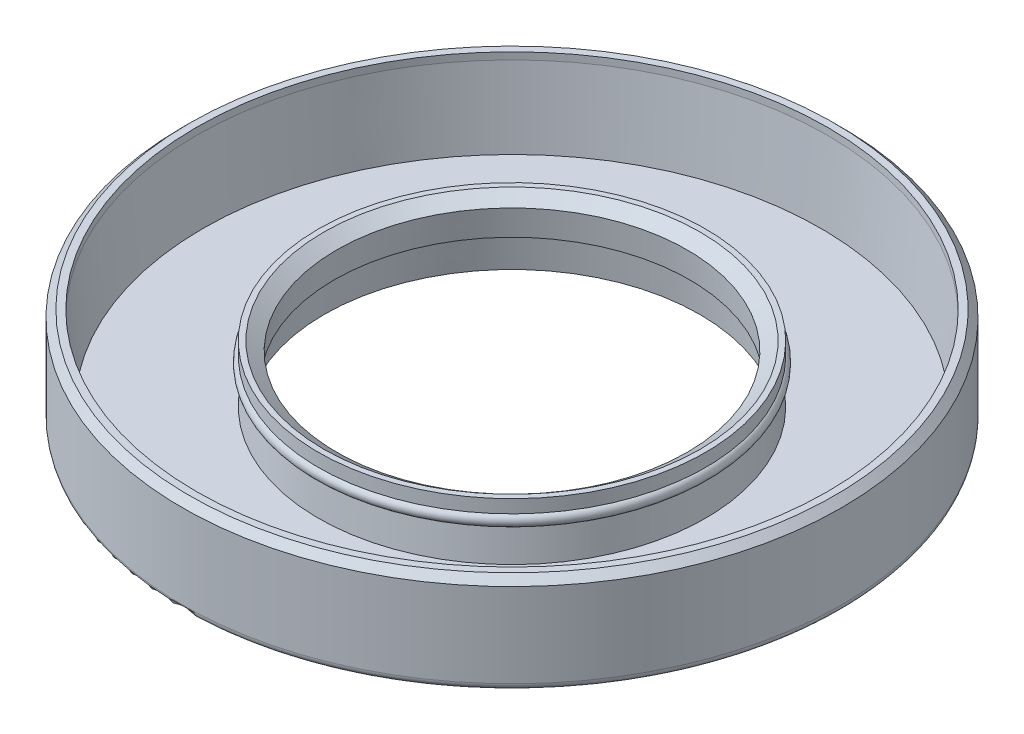
ISO-10303-21;
HEADER;
FILE_DESCRIPTION(('STEP AP214'),'2;1');
FILE_NAME('part.step','',(''),(''),'','','');
FILE_SCHEMA(('AUTOMOTIVE_DESIGN { 1 0 10303 214 1 1 1 1 }'));
ENDSEC;
DATA;
#1=APPLICATION_CONTEXT('core data for automotive mechanical design processes');
#2=APPLICATION_PROTOCOL_DEFINITION('international standard','automotive_design',2000,#1);
#3=PRODUCT_CONTEXT('',#1,'mechanical');
#4=PRODUCT('Part','Part','',(#3));
#5=PRODUCT_RELATED_PRODUCT_CATEGORY('part','',(#4));
#6=PRODUCT_DEFINITION_FORMATION('','',#4);
#7=PRODUCT_DEFINITION_CONTEXT('part definition',#1,'design');
#8=PRODUCT_DEFINITION('design','',#6,#7);
#9=PRODUCT_DEFINITION_SHAPE('','',#8);
#10=(LENGTH_UNIT() NAMED_UNIT(*) SI_UNIT(.MILLI.,.METRE.));
#11=(NAMED_UNIT(*) PLANE_ANGLE_UNIT() SI_UNIT($,.RADIAN.));
#12=(NAMED_UNIT(*) SI_UNIT($,.STERADIAN.) SOLID_ANGLE_UNIT());
#13=UNCERTAINTY_MEASURE_WITH_UNIT(LENGTH_MEASURE(1.E-05),#10,'distance_accuracy_value','');
#14=(GEOMETRIC_REPRESENTATION_CONTEXT(3) GLOBAL_UNCERTAINTY_ASSIGNED_CONTEXT((#13)) GLOBAL_UNIT_ASSIGNED_CONTEXT((#10,
#11,#12)) REPRESENTATION_CONTEXT('',''));
#15=CARTESIAN_POINT('',(0.,0.,0.));
#16=DIRECTION('',(0.,0.,1.));
#17=DIRECTION('',(1.,0.,0.));
#18=AXIS2_PLACEMENT_3D('',#15,#16,#17);
#19=CARTESIAN_POINT('',(0.,1.,0.));
#20=DIRECTION('',(0.,1.,0.));
#21=DIRECTION('',(-1.,0.,0.));
#22=AXIS2_PLACEMENT_3D('',#19,#20,#21);
#23=CONICAL_SURFACE('',#22,22.0188123506074,0.0872664625997133);
#24=CARTESIAN_POINT('',(0.,6.5,0.));
#25=DIRECTION('',(0.,1.,0.));
#26=DIRECTION('',(-1.,0.,0.));
#27=AXIS2_PLACEMENT_3D('',#24,#25,#26);
#28=CIRCLE('',#27,22.5);
#29=CARTESIAN_POINT('',(-22.5,6.5,0.));
#30=VERTEX_POINT('',#29);
#31=EDGE_CURVE('E10',#30,#30,#28,.T.);
#32=ORIENTED_EDGE('',*,*,#31,.T.);
#33=EDGE_LOOP('',(#32));
#34=FACE_BOUND('',#33,.T.);
#35=CARTESIAN_POINT('',(0.,1.,0.));
#36=DIRECTION('',(0.,1.,0.));
#37=DIRECTION('',(-1.,0.,0.));
#38=AXIS2_PLACEMENT_3D('',#35,#36,#37);
#39=CIRCLE('',#38,22.0188123506074);
#40=CARTESIAN_POINT('',(-22.0188123506074,0.999999999999998,0.));
#41=VERTEX_POINT('',#40);
#42=EDGE_CURVE('E67',#41,#41,#39,.T.);
#43=ORIENTED_EDGE('',*,*,#42,.F.);
#44=EDGE_LOOP('',(#43));
#45=FACE_BOUND('',#44,.T.);
#46=ADVANCED_FACE('F15',(#34,#45),#23,.F.);
#47=CARTESIAN_POINT('',(0.,5.83619336924023,0.));
#48=DIRECTION('',(0.,1.,0.));
#49=DIRECTION('',(-1.,0.,0.));
#50=AXIS2_PLACEMENT_3D('',#47,#48,#49);
#51=CYLINDRICAL_SURFACE('',#50,22.5);
#52=CARTESIAN_POINT('',(0.,7.,0.));
#53=DIRECTION('',(0.,1.,0.));
#54=DIRECTION('',(-1.,0.,0.));
#55=AXIS2_PLACEMENT_3D('',#52,#53,#54);
#56=CIRCLE('',#55,22.5);
#57=CARTESIAN_POINT('',(-22.5,7.,0.));
#58=VERTEX_POINT('',#57);
#59=EDGE_CURVE('E21',#58,#58,#56,.T.);
#60=ORIENTED_EDGE('',*,*,#59,.T.);
#61=EDGE_LOOP('',(#60));
#62=FACE_BOUND('',#61,.T.);
#63=ORIENTED_EDGE('',*,*,#31,.F.);
#64=EDGE_LOOP('',(#63));
#65=FACE_BOUND('',#64,.T.);
#66=ADVANCED_FACE('F75',(#62,#65),#51,.F.);
#67=CARTESIAN_POINT('',(-22.5,7.,0.));
#68=DIRECTION('',(0.,1.,0.));
#69=DIRECTION('',(-1.,0.,0.));
#70=AXIS2_PLACEMENT_3D('',#67,#68,#69);
#71=PLANE('',#70);
#72=CARTESIAN_POINT('',(0.,7.,0.));
#73=DIRECTION('',(0.,1.,0.));
#74=DIRECTION('',(-1.,0.,0.));
#75=AXIS2_PLACEMENT_3D('',#72,#73,#74);
#76=CIRCLE('',#75,23.);
#77=CARTESIAN_POINT('',(-23.,7.,0.));
#78=VERTEX_POINT('',#77);
#79=EDGE_CURVE('E25',#78,#78,#76,.T.);
#80=ORIENTED_EDGE('',*,*,#79,.T.);
#81=EDGE_LOOP('',(#80));
#82=FACE_BOUND('',#81,.T.);
#83=ORIENTED_EDGE('',*,*,#59,.F.);
#84=EDGE_LOOP('',(#83));
#85=FACE_BOUND('',#84,.T.);
#86=ADVANCED_FACE('F81',(#82,#85),#71,.T.);
#87=CARTESIAN_POINT('',(0.,7.,0.));
#88=DIRECTION('',(0.,-1.,0.));
#89=DIRECTION('',(1.,0.,0.));
#90=AXIS2_PLACEMENT_3D('',#87,#88,#89);
#91=CONICAL_SURFACE('',#90,23.,0.785398163397449);
#92=CARTESIAN_POINT('',(0.,6.5,0.));
#93=DIRECTION('',(0.,1.,0.));
#94=DIRECTION('',(-1.,0.,0.));
#95=AXIS2_PLACEMENT_3D('',#92,#93,#94);
#96=CIRCLE('',#95,23.5);
#97=CARTESIAN_POINT('',(-23.5,6.5,0.));
#98=VERTEX_POINT('',#97);
#99=EDGE_CURVE('E29',#98,#98,#96,.T.);
#100=ORIENTED_EDGE('',*,*,#99,.T.);
#101=EDGE_LOOP('',(#100));
#102=FACE_BOUND('',#101,.T.);
#103=ORIENTED_EDGE('',*,*,#79,.F.);
#104=EDGE_LOOP('',(#103));
#105=FACE_BOUND('',#104,.T.);
#106=ADVANCED_FACE('F86',(#102,#105),#91,.T.);
#107=CARTESIAN_POINT('',(0.,5.83619336924023,0.));
#108=DIRECTION('',(0.,1.,0.));
#109=DIRECTION('',(-1.,0.,0.));
#110=AXIS2_PLACEMENT_3D('',#107,#108,#109);
#111=CYLINDRICAL_SURFACE('',#110,23.5);
#112=CARTESIAN_POINT('',(0.,0.5,0.));
#113=DIRECTION('',(0.,1.,0.));
#114=DIRECTION('',(-1.,0.,0.));
#115=AXIS2_PLACEMENT_3D('',#112,#113,#114);
#116=CIRCLE('',#115,23.5);
#117=CARTESIAN_POINT('',(-23.5,0.499999999999997,0.));
#118=VERTEX_POINT('',#117);
#119=EDGE_CURVE('E34',#118,#118,#116,.T.);
#120=ORIENTED_EDGE('',*,*,#119,.T.);
#121=EDGE_LOOP('',(#120));
#122=FACE_BOUND('',#121,.T.);
#123=ORIENTED_EDGE('',*,*,#99,.F.);
#124=EDGE_LOOP('',(#123));
#125=FACE_BOUND('',#124,.T.);
#126=ADVANCED_FACE('F93',(#122,#125),#111,.T.);
#127=CARTESIAN_POINT('',(0.,0.5,0.));
#128=DIRECTION('',(0.,1.,0.));
#129=DIRECTION('',(-1.,0.,0.));
#130=AXIS2_PLACEMENT_3D('',#127,#128,#129);
#131=TOROIDAL_SURFACE('',#130,23.,0.5);
#132=CARTESIAN_POINT('',(0.,0.,0.));
#133=DIRECTION('',(0.,1.,0.));
#134=DIRECTION('',(-1.,0.,0.));
#135=AXIS2_PLACEMENT_3D('',#132,#133,#134);
#136=CIRCLE('',#135,23.);
#137=CARTESIAN_POINT('',(-23.,0.,0.));
#138=VERTEX_POINT('',#137);
#139=EDGE_CURVE('E37',#138,#138,#136,.T.);
#140=ORIENTED_EDGE('',*,*,#139,.T.);
#141=EDGE_LOOP('',(#140));
#142=FACE_BOUND('',#141,.T.);
#143=ORIENTED_EDGE('',*,*,#119,.F.);
#144=EDGE_LOOP('',(#143));
#145=FACE_BOUND('',#144,.T.);
#146=ADVANCED_FACE('F97',(#142,#145),#131,.T.);
#147=CARTESIAN_POINT('',(-23.,0.,0.));
#148=DIRECTION('',(0.,-1.,0.));
#149=DIRECTION('',(1.,0.,0.));
#150=AXIS2_PLACEMENT_3D('',#147,#148,#149);
#151=PLANE('',#150);
#152=CARTESIAN_POINT('',(0.,0.,0.));
#153=DIRECTION('',(0.,1.,0.));
#154=DIRECTION('',(-1.,0.,0.));
#155=AXIS2_PLACEMENT_3D('',#152,#153,#154);
#156=CIRCLE('',#155,13.3874497956148);
#157=CARTESIAN_POINT('',(-13.3874497956148,0.,0.));
#158=VERTEX_POINT('',#157);
#159=EDGE_CURVE('E40',#158,#158,#156,.T.);
#160=ORIENTED_EDGE('',*,*,#159,.T.);
#161=EDGE_LOOP('',(#160));
#162=FACE_BOUND('',#161,.T.);
#163=ORIENTED_EDGE('',*,*,#139,.F.);
#164=EDGE_LOOP('',(#163));
#165=FACE_BOUND('',#164,.T.);
#166=ADVANCED_FACE('F101',(#162,#165),#151,.T.);
#167=CARTESIAN_POINT('',(0.,0.,0.));
#168=DIRECTION('',(0.,-1.,0.));
#169=DIRECTION('',(1.,0.,0.));
#170=AXIS2_PLACEMENT_3D('',#167,#168,#169);
#171=CONICAL_SURFACE('',#170,13.3874497956148,0.087266462599719);
#172=CARTESIAN_POINT('',(0.,2.5,0.));
#173=DIRECTION('',(0.,1.,0.));
#174=DIRECTION('',(-1.,0.,0.));
#175=AXIS2_PLACEMENT_3D('',#172,#173,#174);
#176=CIRCLE('',#175,13.1687281368);
#177=CARTESIAN_POINT('',(-13.1687281368,2.5,0.));
#178=VERTEX_POINT('',#177);
#179=EDGE_CURVE('E43',#178,#178,#176,.T.);
#180=ORIENTED_EDGE('',*,*,#179,.T.);
#181=EDGE_LOOP('',(#180));
#182=FACE_BOUND('',#181,.T.);
#183=ORIENTED_EDGE('',*,*,#159,.F.);
#184=EDGE_LOOP('',(#183));
#185=FACE_BOUND('',#184,.T.);
#186=ADVANCED_FACE('F105',(#182,#185),#171,.F.);
#187=CARTESIAN_POINT('',(-12.6687281368,2.5,0.));
#188=DIRECTION('',(0.,-1.,0.));
#189=DIRECTION('',(1.,0.,0.));
#190=AXIS2_PLACEMENT_3D('',#187,#188,#189);
#191=PLANE('',#190);
#192=CARTESIAN_POINT('',(0.,2.5,0.));
#193=DIRECTION('',(0.,1.,0.));
#194=DIRECTION('',(-1.,0.,0.));
#195=AXIS2_PLACEMENT_3D('',#192,#193,#194);
#196=CIRCLE('',#195,12.6687281368);
#197=CARTESIAN_POINT('',(-12.6687281368,2.5,0.));
#198=VERTEX_POINT('',#197);
#199=EDGE_CURVE('E46',#198,#198,#196,.T.);
#200=ORIENTED_EDGE('',*,*,#199,.T.);
#201=EDGE_LOOP('',(#200));
#202=FACE_BOUND('',#201,.T.);
#203=ORIENTED_EDGE('',*,*,#179,.F.);
#204=EDGE_LOOP('',(#203));
#205=FACE_BOUND('',#204,.T.);
#206=ADVANCED_FACE('F109',(#202,#205),#191,.T.);
#207=CARTESIAN_POINT('',(0.,2.5,0.));
#208=DIRECTION('',(0.,-1.,0.));
#209=DIRECTION('',(1.,0.,0.));
#210=AXIS2_PLACEMENT_3D('',#207,#208,#209);
#211=CONICAL_SURFACE('',#210,12.6687281368,0.087266462599721);
#212=CARTESIAN_POINT('',(0.,4.42857142857144,0.));
#213=DIRECTION('',(0.,1.,0.));
#214=DIRECTION('',(-1.,0.,0.));
#215=AXIS2_PLACEMENT_3D('',#212,#213,#214);
#216=CIRCLE('',#215,12.5);
#217=CARTESIAN_POINT('',(-12.5,4.42857142857144,0.));
#218=VERTEX_POINT('',#217);
#219=EDGE_CURVE('E49',#218,#218,#216,.T.);
#220=ORIENTED_EDGE('',*,*,#219,.T.);
#221=EDGE_LOOP('',(#220));
#222=FACE_BOUND('',#221,.T.);
#223=ORIENTED_EDGE('',*,*,#199,.F.);
#224=EDGE_LOOP('',(#223));
#225=FACE_BOUND('',#224,.T.);
#226=ADVANCED_FACE('F113',(#222,#225),#211,.F.);
#227=CARTESIAN_POINT('',(0.,4.42857142857144,0.));
#228=DIRECTION('',(0.,1.,0.));
#229=DIRECTION('',(-1.,0.,0.));
#230=AXIS2_PLACEMENT_3D('',#227,#228,#229);
#231=CONICAL_SURFACE('',#230,12.5,0.95993108859688);
#232=CARTESIAN_POINT('',(0.,5.07142857142858,0.));
#233=DIRECTION('',(0.,1.,0.));
#234=DIRECTION('',(-1.,0.,0.));
#235=AXIS2_PLACEMENT_3D('',#232,#233,#234);
#236=CIRCLE('',#235,13.4180951471914);
#237=CARTESIAN_POINT('',(-13.4180951471914,5.07142857142858,0.));
#238=VERTEX_POINT('',#237);
#239=EDGE_CURVE('E52',#238,#238,#236,.T.);
#240=ORIENTED_EDGE('',*,*,#239,.T.);
#241=EDGE_LOOP('',(#240));
#242=FACE_BOUND('',#241,.T.);
#243=ORIENTED_EDGE('',*,*,#219,.F.);
#244=EDGE_LOOP('',(#243));
#245=FACE_BOUND('',#244,.T.);
#246=ADVANCED_FACE('F117',(#242,#245),#231,.F.);
#247=CARTESIAN_POINT('',(-13.4180951471914,5.07142857142858,0.));
#248=DIRECTION('',(0.,1.,0.));
#249=DIRECTION('',(-1.,0.,0.));
#250=AXIS2_PLACEMENT_3D('',#247,#248,#249);
#251=PLANE('',#250);
#252=CARTESIAN_POINT('',(0.,5.07142857142858,0.));
#253=DIRECTION('',(0.,1.,0.));
#254=DIRECTION('',(-1.,0.,0.));
#255=AXIS2_PLACEMENT_3D('',#252,#253,#254);
#256=CIRCLE('',#255,13.8018710508606);
#257=CARTESIAN_POINT('',(-13.8018710508606,5.07142857142858,0.));
#258=VERTEX_POINT('',#257);
#259=EDGE_CURVE('E55',#258,#258,#256,.T.);
#260=ORIENTED_EDGE('',*,*,#259,.T.);
#261=EDGE_LOOP('',(#260));
#262=FACE_BOUND('',#261,.T.);
#263=ORIENTED_EDGE('',*,*,#239,.F.);
#264=EDGE_LOOP('',(#263));
#265=FACE_BOUND('',#264,.T.);
#266=ADVANCED_FACE('F121',(#262,#265),#251,.T.);
#267=CARTESIAN_POINT('',(0.,5.83619336924023,0.));
#268=DIRECTION('',(0.,1.,0.));
#269=DIRECTION('',(-1.,0.,0.));
#270=AXIS2_PLACEMENT_3D('',#267,#268,#269);
#271=CYLINDRICAL_SURFACE('',#270,13.8018710508606);
#272=CARTESIAN_POINT('',(0.,4.13322405605208,0.));
#273=DIRECTION('',(0.,1.,0.));
#274=DIRECTION('',(-1.,0.,0.));
#275=AXIS2_PLACEMENT_3D('',#272,#273,#274);
#276=CIRCLE('',#275,13.8018710508606);
#277=CARTESIAN_POINT('',(-13.8018710508606,4.13322405605208,0.));
#278=VERTEX_POINT('',#277);
#279=EDGE_CURVE('E58',#278,#278,#276,.T.);
#280=ORIENTED_EDGE('',*,*,#279,.T.);
#281=EDGE_LOOP('',(#280));
#282=FACE_BOUND('',#281,.T.);
#283=ORIENTED_EDGE('',*,*,#259,.F.);
#284=EDGE_LOOP('',(#283));
#285=FACE_BOUND('',#284,.T.);
#286=ADVANCED_FACE('F125',(#282,#285),#271,.T.);
#287=CARTESIAN_POINT('',(0.,3.7332240560521,0.));
#288=DIRECTION('',(0.,1.,0.));
#289=DIRECTION('',(-1.,0.,0.));
#290=AXIS2_PLACEMENT_3D('',#287,#288,#289);
#291=TOROIDAL_SURFACE('',#290,13.6018710508606,0.447213595499938);
#292=CARTESIAN_POINT('',(0.,3.28601046055218,0.));
#293=DIRECTION('',(0.,1.,0.));
#294=DIRECTION('',(-1.,0.,0.));
#295=AXIS2_PLACEMENT_3D('',#292,#293,#294);
#296=CIRCLE('',#295,13.6018710508606);
#297=CARTESIAN_POINT('',(-13.6018710508606,3.28601046055218,0.));
#298=VERTEX_POINT('',#297);
#299=EDGE_CURVE('E61',#298,#298,#296,.T.);
#300=ORIENTED_EDGE('',*,*,#299,.T.);
#301=EDGE_LOOP('',(#300));
#302=FACE_BOUND('',#301,.T.);
#303=ORIENTED_EDGE('',*,*,#279,.F.);
#304=EDGE_LOOP('',(#303));
#305=FACE_BOUND('',#304,.T.);
#306=ADVANCED_FACE('F129',(#302,#305),#291,.T.);
#307=CARTESIAN_POINT('',(0.,3.28601046055218,0.));
#308=DIRECTION('',(0.,-1.,0.));
#309=DIRECTION('',(1.,0.,0.));
#310=AXIS2_PLACEMENT_3D('',#307,#308,#309);
#311=CONICAL_SURFACE('',#310,13.6018710508606,0.0872664625997215);
#312=CARTESIAN_POINT('',(0.,1.,0.));
#313=DIRECTION('',(0.,1.,0.));
#314=DIRECTION('',(-1.,0.,0.));
#315=AXIS2_PLACEMENT_3D('',#312,#313,#314);
#316=CIRCLE('',#315,13.8018710508606);
#317=CARTESIAN_POINT('',(-13.8018710508606,0.999999999999999,0.));
#318=VERTEX_POINT('',#317);
#319=EDGE_CURVE('E64',#318,#318,#316,.T.);
#320=ORIENTED_EDGE('',*,*,#319,.T.);
#321=EDGE_LOOP('',(#320));
#322=FACE_BOUND('',#321,.T.);
#323=ORIENTED_EDGE('',*,*,#299,.F.);
#324=EDGE_LOOP('',(#323));
#325=FACE_BOUND('',#324,.T.);
#326=ADVANCED_FACE('F133',(#322,#325),#311,.T.);
#327=CARTESIAN_POINT('',(-22.0188123506074,1.,0.));
#328=DIRECTION('',(0.,1.,0.));
#329=DIRECTION('',(-1.,0.,0.));
#330=AXIS2_PLACEMENT_3D('',#327,#328,#329);
#331=PLANE('',#330);
#332=ORIENTED_EDGE('',*,*,#42,.T.);
#333=EDGE_LOOP('',(#332));
#334=FACE_BOUND('',#333,.T.);
#335=ORIENTED_EDGE('',*,*,#319,.F.);
#336=EDGE_LOOP('',(#335));
#337=FACE_BOUND('',#336,.T.);
#338=ADVANCED_FACE('F71',(#334,#337),#331,.T.);
#339=CLOSED_SHELL('',(#46,#66,#86,#106,#126,#146,#166,#186,#206,#226,#246,#266,#286,#306,#326,#338));
#340=MANIFOLD_SOLID_BREP('B1',#339);
#341=ADVANCED_BREP_SHAPE_REPRESENTATION('',(#18,#340),#14);
#342=SHAPE_DEFINITION_REPRESENTATION(#9,#341);
ENDSEC;
END-ISO-10303-21;
